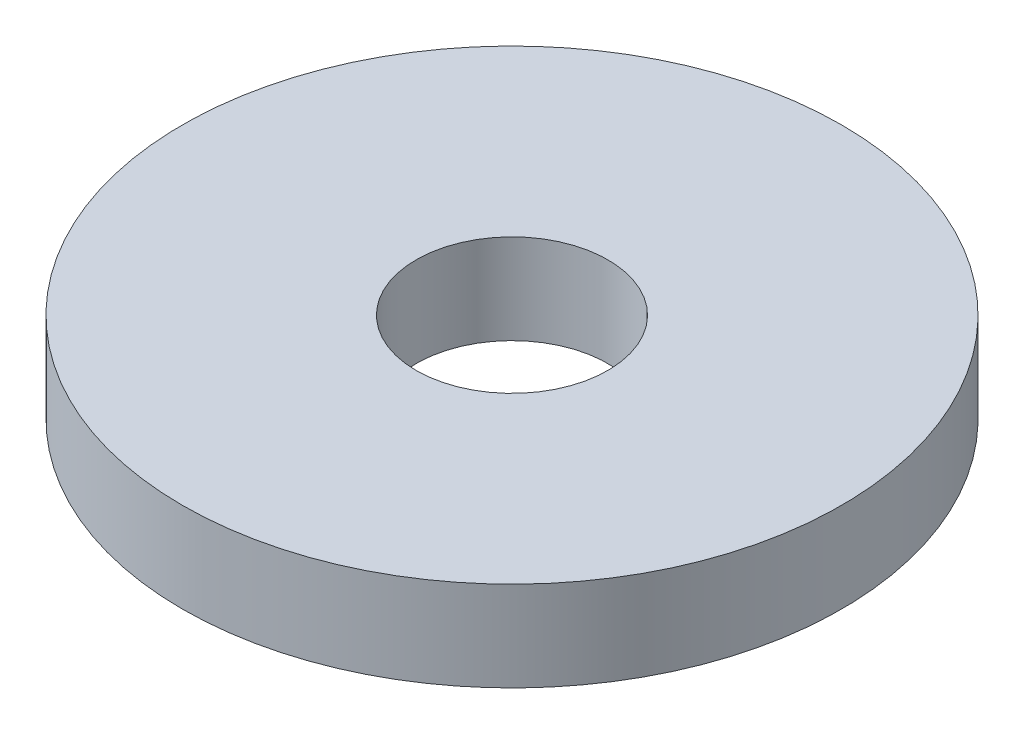
ISO-10303-21;
HEADER;
FILE_DESCRIPTION(('STEP AP214'),'2;1');
FILE_NAME('part.step','',(''),(''),'','','');
FILE_SCHEMA(('AUTOMOTIVE_DESIGN { 1 0 10303 214 1 1 1 1 }'));
ENDSEC;
DATA;
#1=APPLICATION_CONTEXT('core data for automotive mechanical design processes');
#2=APPLICATION_PROTOCOL_DEFINITION('international standard','automotive_design',2000,#1);
#3=PRODUCT_CONTEXT('',#1,'mechanical');
#4=PRODUCT('Part','Part','',(#3));
#5=PRODUCT_RELATED_PRODUCT_CATEGORY('part','',(#4));
#6=PRODUCT_DEFINITION_FORMATION('','',#4);
#7=PRODUCT_DEFINITION_CONTEXT('part definition',#1,'design');
#8=PRODUCT_DEFINITION('design','',#6,#7);
#9=PRODUCT_DEFINITION_SHAPE('','',#8);
#10=(LENGTH_UNIT() NAMED_UNIT(*) SI_UNIT(.MILLI.,.METRE.));
#11=(NAMED_UNIT(*) PLANE_ANGLE_UNIT() SI_UNIT($,.RADIAN.));
#12=(NAMED_UNIT(*) SI_UNIT($,.STERADIAN.) SOLID_ANGLE_UNIT());
#13=UNCERTAINTY_MEASURE_WITH_UNIT(LENGTH_MEASURE(1.E-05),#10,'distance_accuracy_value','');
#14=(GEOMETRIC_REPRESENTATION_CONTEXT(3) GLOBAL_UNCERTAINTY_ASSIGNED_CONTEXT((#13)) GLOBAL_UNIT_ASSIGNED_CONTEXT((#10,
#11,#12)) REPRESENTATION_CONTEXT('',''));
#15=CARTESIAN_POINT('',(0.,0.,0.));
#16=DIRECTION('',(0.,0.,1.));
#17=DIRECTION('',(1.,0.,0.));
#18=AXIS2_PLACEMENT_3D('',#15,#16,#17);
#19=CARTESIAN_POINT('',(0.,1.5,0.));
#20=DIRECTION('',(0.,1.,0.));
#21=DIRECTION('',(0.,0.,1.));
#22=AXIS2_PLACEMENT_3D('',#19,#20,#21);
#23=PLANE('',#22);
#24=CARTESIAN_POINT('',(0.,1.5,0.));
#25=DIRECTION('',(0.,1.,0.));
#26=DIRECTION('',(0.,0.,1.));
#27=AXIS2_PLACEMENT_3D('',#24,#25,#26);
#28=CIRCLE('',#27,5.5);
#29=CARTESIAN_POINT('',(0.,1.5,5.5));
#30=VERTEX_POINT('',#29);
#31=EDGE_CURVE('E10',#30,#30,#28,.T.);
#32=ORIENTED_EDGE('',*,*,#31,.T.);
#33=EDGE_LOOP('',(#32));
#34=FACE_BOUND('',#33,.T.);
#35=CARTESIAN_POINT('',(0.,1.5,0.));
#36=DIRECTION('',(0.,1.,0.));
#37=DIRECTION('',(0.,0.,1.));
#38=AXIS2_PLACEMENT_3D('',#35,#36,#37);
#39=CIRCLE('',#38,1.6);
#40=CARTESIAN_POINT('',(0.,1.5,1.6));
#41=VERTEX_POINT('',#40);
#42=EDGE_CURVE('E50',#41,#41,#39,.T.);
#43=ORIENTED_EDGE('',*,*,#42,.F.);
#44=EDGE_LOOP('',(#43));
#45=FACE_BOUND('',#44,.T.);
#46=ADVANCED_FACE('F37',(#34,#45),#23,.T.);
#47=CARTESIAN_POINT('',(0.,0.,0.));
#48=DIRECTION('',(0.,1.,0.));
#49=DIRECTION('',(0.,0.,1.));
#50=AXIS2_PLACEMENT_3D('',#47,#48,#49);
#51=PLANE('',#50);
#52=CARTESIAN_POINT('',(0.,0.,0.));
#53=DIRECTION('',(0.,1.,0.));
#54=DIRECTION('',(0.,0.,1.));
#55=AXIS2_PLACEMENT_3D('',#52,#53,#54);
#56=CIRCLE('',#55,5.5);
#57=CARTESIAN_POINT('',(0.,0.,5.5));
#58=VERTEX_POINT('',#57);
#59=EDGE_CURVE('E41',#58,#58,#56,.T.);
#60=ORIENTED_EDGE('',*,*,#59,.F.);
#61=EDGE_LOOP('',(#60));
#62=FACE_BOUND('',#61,.T.);
#63=CARTESIAN_POINT('',(0.,0.,0.));
#64=DIRECTION('',(0.,1.,0.));
#65=DIRECTION('',(0.,0.,1.));
#66=AXIS2_PLACEMENT_3D('',#63,#64,#65);
#67=CIRCLE('',#66,1.6);
#68=CARTESIAN_POINT('',(0.,0.,1.6));
#69=VERTEX_POINT('',#68);
#70=EDGE_CURVE('E52',#69,#69,#67,.T.);
#71=ORIENTED_EDGE('',*,*,#70,.T.);
#72=EDGE_LOOP('',(#71));
#73=FACE_BOUND('',#72,.T.);
#74=ADVANCED_FACE('F64',(#62,#73),#51,.F.);
#75=CARTESIAN_POINT('',(0.,1.5,0.));
#76=DIRECTION('',(0.,-1.,0.));
#77=DIRECTION('',(0.,0.,-1.));
#78=AXIS2_PLACEMENT_3D('',#75,#76,#77);
#79=CYLINDRICAL_SURFACE('',#78,5.5);
#80=ORIENTED_EDGE('',*,*,#31,.F.);
#81=EDGE_LOOP('',(#80));
#82=FACE_BOUND('',#81,.T.);
#83=ORIENTED_EDGE('',*,*,#59,.T.);
#84=EDGE_LOOP('',(#83));
#85=FACE_BOUND('',#84,.T.);
#86=ADVANCED_FACE('F39',(#82,#85),#79,.T.);
#87=CARTESIAN_POINT('',(0.,1.5,0.));
#88=DIRECTION('',(0.,-1.,0.));
#89=DIRECTION('',(0.,0.,-1.));
#90=AXIS2_PLACEMENT_3D('',#87,#88,#89);
#91=CYLINDRICAL_SURFACE('',#90,1.6);
#92=ORIENTED_EDGE('',*,*,#42,.T.);
#93=EDGE_LOOP('',(#92));
#94=FACE_BOUND('',#93,.T.);
#95=ORIENTED_EDGE('',*,*,#70,.F.);
#96=EDGE_LOOP('',(#95));
#97=FACE_BOUND('',#96,.T.);
#98=ADVANCED_FACE('F60',(#94,#97),#91,.F.);
#99=CLOSED_SHELL('',(#46,#74,#86,#98));
#100=MANIFOLD_SOLID_BREP('B2',#99);
#101=ADVANCED_BREP_SHAPE_REPRESENTATION('',(#18,#100),#14);
#102=SHAPE_DEFINITION_REPRESENTATION(#9,#101);
ENDSEC;
END-ISO-10303-21;
